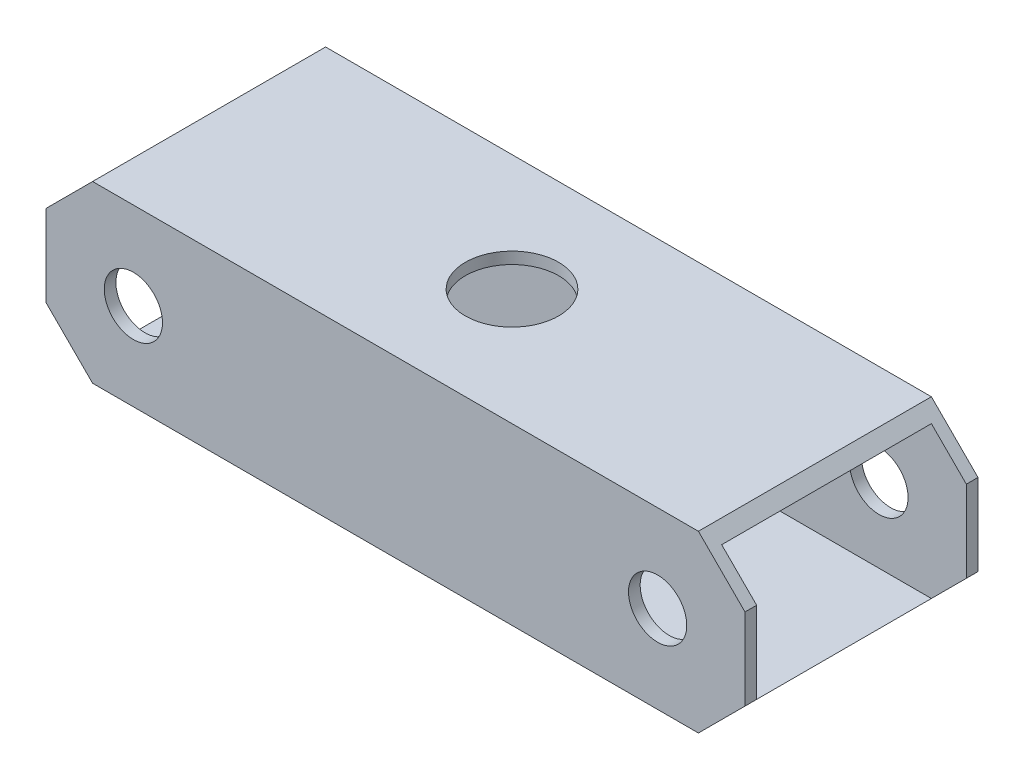
ISO-10303-21;
HEADER;
FILE_DESCRIPTION(('STEP AP214'),'2;1');
FILE_NAME('part.step','',(''),(''),'','','');
FILE_SCHEMA(('AUTOMOTIVE_DESIGN { 1 0 10303 214 1 1 1 1 }'));
ENDSEC;
DATA;
#1=APPLICATION_CONTEXT('core data for automotive mechanical design processes');
#2=APPLICATION_PROTOCOL_DEFINITION('international standard','automotive_design',2000,#1);
#3=PRODUCT_CONTEXT('',#1,'mechanical');
#4=PRODUCT('Part','Part','',(#3));
#5=PRODUCT_RELATED_PRODUCT_CATEGORY('part','',(#4));
#6=PRODUCT_DEFINITION_FORMATION('','',#4);
#7=PRODUCT_DEFINITION_CONTEXT('part definition',#1,'design');
#8=PRODUCT_DEFINITION('design','',#6,#7);
#9=PRODUCT_DEFINITION_SHAPE('','',#8);
#10=(LENGTH_UNIT() NAMED_UNIT(*) SI_UNIT(.MILLI.,.METRE.));
#11=(NAMED_UNIT(*) PLANE_ANGLE_UNIT() SI_UNIT($,.RADIAN.));
#12=(NAMED_UNIT(*) SI_UNIT($,.STERADIAN.) SOLID_ANGLE_UNIT());
#13=UNCERTAINTY_MEASURE_WITH_UNIT(LENGTH_MEASURE(1.E-05),#10,'distance_accuracy_value','');
#14=(GEOMETRIC_REPRESENTATION_CONTEXT(3) GLOBAL_UNCERTAINTY_ASSIGNED_CONTEXT((#13)) GLOBAL_UNIT_ASSIGNED_CONTEXT((#10,
#11,#12)) REPRESENTATION_CONTEXT('',''));
#15=CARTESIAN_POINT('',(0.,0.,0.));
#16=DIRECTION('',(0.,0.,1.));
#17=DIRECTION('',(1.,0.,0.));
#18=AXIS2_PLACEMENT_3D('',#15,#16,#17);
#19=CARTESIAN_POINT('',(120.,30.,0.));
#20=DIRECTION('',(-1.,0.,0.));
#21=DIRECTION('',(0.,0.,1.));
#22=AXIS2_PLACEMENT_3D('',#19,#20,#21);
#23=PLANE('',#22);
#24=DIRECTION('',(0.,-1.,0.));
#25=VECTOR('',#24,1.);
#26=CARTESIAN_POINT('',(120.,30.,0.));
#27=LINE('',#26,#25);
#28=CARTESIAN_POINT('',(120.,21.9999999999999,0.));
#29=VERTEX_POINT('',#28);
#30=CARTESIAN_POINT('',(120.,8.00000000000014,0.));
#31=VERTEX_POINT('',#30);
#32=EDGE_CURVE('E292',#29,#31,#27,.T.);
#33=ORIENTED_EDGE('',*,*,#32,.T.);
#34=DIRECTION('',(0.,0.,-1.));
#35=VECTOR('',#34,1.);
#36=CARTESIAN_POINT('',(120.,8.00000000000014,-40.));
#37=LINE('',#36,#35);
#38=CARTESIAN_POINT('',(120.,8.00000000000014,-2.));
#39=VERTEX_POINT('',#38);
#40=EDGE_CURVE('E14',#31,#39,#37,.T.);
#41=ORIENTED_EDGE('',*,*,#40,.T.);
#42=DIRECTION('',(0.,1.,0.));
#43=VECTOR('',#42,1.);
#44=CARTESIAN_POINT('',(120.,2.00000000000001,-2.));
#45=LINE('',#44,#43);
#46=CARTESIAN_POINT('',(120.,21.9999999999999,-2.));
#47=VERTEX_POINT('',#46);
#48=EDGE_CURVE('E349',#39,#47,#45,.T.);
#49=ORIENTED_EDGE('',*,*,#48,.T.);
#50=DIRECTION('',(0.,0.,1.));
#51=VECTOR('',#50,1.);
#52=CARTESIAN_POINT('',(120.,21.9999999999999,0.));
#53=LINE('',#52,#51);
#54=EDGE_CURVE('E515',#47,#29,#53,.T.);
#55=ORIENTED_EDGE('',*,*,#54,.T.);
#56=EDGE_LOOP('',(#33,#41,#49,#55));
#57=FACE_BOUND('',#56,.T.);
#58=ADVANCED_FACE('F156',(#57),#23,.F.);
#59=CARTESIAN_POINT('',(0.,30.,0.));
#60=DIRECTION('',(1.,0.,0.));
#61=DIRECTION('',(0.,0.,-1.));
#62=AXIS2_PLACEMENT_3D('',#59,#60,#61);
#63=PLANE('',#62);
#64=DIRECTION('',(0.,-1.,0.));
#65=VECTOR('',#64,1.);
#66=CARTESIAN_POINT('',(0.,30.,-40.));
#67=LINE('',#66,#65);
#68=CARTESIAN_POINT('',(0.,21.9999999999999,-40.));
#69=VERTEX_POINT('',#68);
#70=CARTESIAN_POINT('',(0.,8.00000000000014,-40.));
#71=VERTEX_POINT('',#70);
#72=EDGE_CURVE('E369',#69,#71,#67,.T.);
#73=ORIENTED_EDGE('',*,*,#72,.T.);
#74=DIRECTION('',(0.,0.,1.));
#75=VECTOR('',#74,1.);
#76=CARTESIAN_POINT('',(0.,8.00000000000014,0.));
#77=LINE('',#76,#75);
#78=CARTESIAN_POINT('',(0.,8.00000000000014,-38.));
#79=VERTEX_POINT('',#78);
#80=EDGE_CURVE('E299',#71,#79,#77,.T.);
#81=ORIENTED_EDGE('',*,*,#80,.T.);
#82=DIRECTION('',(0.,-1.,0.));
#83=VECTOR('',#82,1.);
#84=CARTESIAN_POINT('',(0.,28.,-38.));
#85=LINE('',#84,#83);
#86=CARTESIAN_POINT('',(0.,21.9999999999999,-38.));
#87=VERTEX_POINT('',#86);
#88=EDGE_CURVE('E350',#87,#79,#85,.T.);
#89=ORIENTED_EDGE('',*,*,#88,.F.);
#90=DIRECTION('',(0.,0.,-1.));
#91=VECTOR('',#90,1.);
#92=CARTESIAN_POINT('',(0.,21.9999999999999,0.));
#93=LINE('',#92,#91);
#94=EDGE_CURVE('E291',#87,#69,#93,.T.);
#95=ORIENTED_EDGE('',*,*,#94,.T.);
#96=EDGE_LOOP('',(#73,#81,#89,#95));
#97=FACE_BOUND('',#96,.T.);
#98=ADVANCED_FACE('F414',(#97),#63,.F.);
#99=DIRECTION('',(0.,1.,0.));
#100=VECTOR('',#99,1.);
#101=CARTESIAN_POINT('',(0.,2.00000000000001,-2.));
#102=LINE('',#101,#100);
#103=CARTESIAN_POINT('',(0.,8.00000000000014,-2.));
#104=VERTEX_POINT('',#103);
#105=CARTESIAN_POINT('',(0.,21.9999999999999,-2.));
#106=VERTEX_POINT('',#105);
#107=EDGE_CURVE('E346',#104,#106,#102,.T.);
#108=ORIENTED_EDGE('',*,*,#107,.F.);
#109=DIRECTION('',(0.,0.,1.));
#110=VECTOR('',#109,1.);
#111=CARTESIAN_POINT('',(0.,8.00000000000014,0.));
#112=LINE('',#111,#110);
#113=CARTESIAN_POINT('',(0.,8.00000000000014,0.));
#114=VERTEX_POINT('',#113);
#115=EDGE_CURVE('E290',#104,#114,#112,.T.);
#116=ORIENTED_EDGE('',*,*,#115,.T.);
#117=DIRECTION('',(0.,-1.,0.));
#118=VECTOR('',#117,1.);
#119=CARTESIAN_POINT('',(0.,30.,0.));
#120=LINE('',#119,#118);
#121=CARTESIAN_POINT('',(0.,21.9999999999999,0.));
#122=VERTEX_POINT('',#121);
#123=EDGE_CURVE('E273',#122,#114,#120,.T.);
#124=ORIENTED_EDGE('',*,*,#123,.F.);
#125=DIRECTION('',(0.,0.,-1.));
#126=VECTOR('',#125,1.);
#127=CARTESIAN_POINT('',(0.,21.9999999999999,0.));
#128=LINE('',#127,#126);
#129=EDGE_CURVE('E287',#122,#106,#128,.T.);
#130=ORIENTED_EDGE('',*,*,#129,.T.);
#131=EDGE_LOOP('',(#108,#116,#124,#130));
#132=FACE_BOUND('',#131,.T.);
#133=ADVANCED_FACE('F286',(#132),#63,.F.);
#134=DIRECTION('',(0.,-1.,0.));
#135=VECTOR('',#134,1.);
#136=CARTESIAN_POINT('',(120.,28.,-38.));
#137=LINE('',#136,#135);
#138=CARTESIAN_POINT('',(120.,21.9999999999999,-38.));
#139=VERTEX_POINT('',#138);
#140=CARTESIAN_POINT('',(120.,8.00000000000014,-38.));
#141=VERTEX_POINT('',#140);
#142=EDGE_CURVE('E307',#139,#141,#137,.T.);
#143=ORIENTED_EDGE('',*,*,#142,.T.);
#144=DIRECTION('',(0.,0.,-1.));
#145=VECTOR('',#144,1.);
#146=CARTESIAN_POINT('',(120.,8.00000000000014,-40.));
#147=LINE('',#146,#145);
#148=CARTESIAN_POINT('',(120.,8.00000000000014,-40.));
#149=VERTEX_POINT('',#148);
#150=EDGE_CURVE('E165',#141,#149,#147,.T.);
#151=ORIENTED_EDGE('',*,*,#150,.T.);
#152=DIRECTION('',(0.,-1.,0.));
#153=VECTOR('',#152,1.);
#154=CARTESIAN_POINT('',(120.,30.,-40.));
#155=LINE('',#154,#153);
#156=CARTESIAN_POINT('',(120.,21.9999999999999,-40.));
#157=VERTEX_POINT('',#156);
#158=EDGE_CURVE('E367',#157,#149,#155,.T.);
#159=ORIENTED_EDGE('',*,*,#158,.F.);
#160=DIRECTION('',(0.,0.,1.));
#161=VECTOR('',#160,1.);
#162=CARTESIAN_POINT('',(120.,21.9999999999999,0.));
#163=LINE('',#162,#161);
#164=EDGE_CURVE('E517',#157,#139,#163,.T.);
#165=ORIENTED_EDGE('',*,*,#164,.T.);
#166=EDGE_LOOP('',(#143,#151,#159,#165));
#167=FACE_BOUND('',#166,.T.);
#168=ADVANCED_FACE('F401',(#167),#23,.F.);
#169=CARTESIAN_POINT('',(15.,15.,0.));
#170=DIRECTION('',(0.,0.,-1.));
#171=DIRECTION('',(-1.,0.,0.));
#172=AXIS2_PLACEMENT_3D('',#169,#170,#171);
#173=CYLINDRICAL_SURFACE('',#172,5.);
#174=CARTESIAN_POINT('',(15.,15.,-40.));
#175=DIRECTION('',(0.,0.,-1.));
#176=DIRECTION('',(1.,0.,0.));
#177=AXIS2_PLACEMENT_3D('',#174,#175,#176);
#178=CIRCLE('',#177,5.);
#179=CARTESIAN_POINT('',(20.,15.,-40.));
#180=VERTEX_POINT('',#179);
#181=EDGE_CURVE('E383',#180,#180,#178,.T.);
#182=ORIENTED_EDGE('',*,*,#181,.T.);
#183=EDGE_LOOP('',(#182));
#184=FACE_BOUND('',#183,.T.);
#185=CARTESIAN_POINT('',(15.,15.,-38.));
#186=DIRECTION('',(0.,0.,1.));
#187=DIRECTION('',(0.,-1.,0.));
#188=AXIS2_PLACEMENT_3D('',#185,#186,#187);
#189=CIRCLE('',#188,5.);
#190=CARTESIAN_POINT('',(15.,9.99999999999999,-38.));
#191=VERTEX_POINT('',#190);
#192=EDGE_CURVE('E362',#191,#191,#189,.F.);
#193=ORIENTED_EDGE('',*,*,#192,.F.);
#194=EDGE_LOOP('',(#193));
#195=FACE_BOUND('',#194,.T.);
#196=ADVANCED_FACE('F398',(#184,#195),#173,.F.);
#197=CARTESIAN_POINT('',(15.,15.,0.));
#198=DIRECTION('',(0.,0.,-1.));
#199=DIRECTION('',(1.,0.,0.));
#200=AXIS2_PLACEMENT_3D('',#197,#198,#199);
#201=CIRCLE('',#200,5.);
#202=CARTESIAN_POINT('',(20.,15.,0.));
#203=VERTEX_POINT('',#202);
#204=EDGE_CURVE('E386',#203,#203,#201,.T.);
#205=ORIENTED_EDGE('',*,*,#204,.F.);
#206=EDGE_LOOP('',(#205));
#207=FACE_BOUND('',#206,.T.);
#208=CARTESIAN_POINT('',(15.,15.,-2.));
#209=DIRECTION('',(0.,0.,-1.));
#210=DIRECTION('',(0.,1.,0.));
#211=AXIS2_PLACEMENT_3D('',#208,#209,#210);
#212=CIRCLE('',#211,5.);
#213=CARTESIAN_POINT('',(15.,20.,-2.));
#214=VERTEX_POINT('',#213);
#215=EDGE_CURVE('E320',#214,#214,#212,.F.);
#216=ORIENTED_EDGE('',*,*,#215,.F.);
#217=EDGE_LOOP('',(#216));
#218=FACE_BOUND('',#217,.T.);
#219=ADVANCED_FACE('F400',(#207,#218),#173,.F.);
#220=CARTESIAN_POINT('',(105.,15.,0.));
#221=DIRECTION('',(0.,0.,-1.));
#222=DIRECTION('',(-1.,0.,0.));
#223=AXIS2_PLACEMENT_3D('',#220,#221,#222);
#224=CYLINDRICAL_SURFACE('',#223,5.);
#225=CARTESIAN_POINT('',(105.,15.,-40.));
#226=DIRECTION('',(0.,0.,-1.));
#227=DIRECTION('',(-1.,0.,0.));
#228=AXIS2_PLACEMENT_3D('',#225,#226,#227);
#229=CIRCLE('',#228,5.);
#230=CARTESIAN_POINT('',(100.,15.,-40.));
#231=VERTEX_POINT('',#230);
#232=EDGE_CURVE('E389',#231,#231,#229,.T.);
#233=ORIENTED_EDGE('',*,*,#232,.T.);
#234=EDGE_LOOP('',(#233));
#235=FACE_BOUND('',#234,.T.);
#236=CARTESIAN_POINT('',(105.,15.,-38.));
#237=DIRECTION('',(0.,0.,1.));
#238=DIRECTION('',(0.,-1.,0.));
#239=AXIS2_PLACEMENT_3D('',#236,#237,#238);
#240=CIRCLE('',#239,5.);
#241=CARTESIAN_POINT('',(105.,9.99999999999999,-38.));
#242=VERTEX_POINT('',#241);
#243=EDGE_CURVE('E359',#242,#242,#240,.F.);
#244=ORIENTED_EDGE('',*,*,#243,.F.);
#245=EDGE_LOOP('',(#244));
#246=FACE_BOUND('',#245,.T.);
#247=ADVANCED_FACE('F408',(#235,#246),#224,.F.);
#248=CARTESIAN_POINT('',(105.,15.,0.));
#249=DIRECTION('',(0.,0.,-1.));
#250=DIRECTION('',(-1.,0.,0.));
#251=AXIS2_PLACEMENT_3D('',#248,#249,#250);
#252=CIRCLE('',#251,5.);
#253=CARTESIAN_POINT('',(100.,15.,0.));
#254=VERTEX_POINT('',#253);
#255=EDGE_CURVE('E379',#254,#254,#252,.T.);
#256=ORIENTED_EDGE('',*,*,#255,.F.);
#257=EDGE_LOOP('',(#256));
#258=FACE_BOUND('',#257,.T.);
#259=CARTESIAN_POINT('',(105.,15.,-2.));
#260=DIRECTION('',(0.,0.,-1.));
#261=DIRECTION('',(0.,1.,0.));
#262=AXIS2_PLACEMENT_3D('',#259,#260,#261);
#263=CIRCLE('',#262,5.);
#264=CARTESIAN_POINT('',(105.,20.,-2.));
#265=VERTEX_POINT('',#264);
#266=EDGE_CURVE('E348',#265,#265,#263,.F.);
#267=ORIENTED_EDGE('',*,*,#266,.F.);
#268=EDGE_LOOP('',(#267));
#269=FACE_BOUND('',#268,.T.);
#270=ADVANCED_FACE('F425',(#258,#269),#224,.F.);
#271=CARTESIAN_POINT('',(0.,30.,0.));
#272=DIRECTION('',(0.,0.,-1.));
#273=DIRECTION('',(-1.,0.,0.));
#274=AXIS2_PLACEMENT_3D('',#271,#272,#273);
#275=PLANE('',#274);
#276=ORIENTED_EDGE('',*,*,#255,.T.);
#277=EDGE_LOOP('',(#276));
#278=FACE_BOUND('',#277,.T.);
#279=ORIENTED_EDGE('',*,*,#204,.T.);
#280=EDGE_LOOP('',(#279));
#281=FACE_BOUND('',#280,.T.);
#282=ORIENTED_EDGE('',*,*,#123,.T.);
#283=DIRECTION('',(0.707106781186544,-0.707106781186551,0.));
#284=VECTOR('',#283,1.);
#285=CARTESIAN_POINT('',(0.,8.00000000000014,0.));
#286=LINE('',#285,#284);
#287=CARTESIAN_POINT('',(8.00000000000006,0.,0.));
#288=VERTEX_POINT('',#287);
#289=EDGE_CURVE('E281',#114,#288,#286,.T.);
#290=ORIENTED_EDGE('',*,*,#289,.T.);
#291=DIRECTION('',(1.,0.,0.));
#292=VECTOR('',#291,1.);
#293=CARTESIAN_POINT('',(0.,0.,0.));
#294=LINE('',#293,#292);
#295=CARTESIAN_POINT('',(112.,0.,0.));
#296=VERTEX_POINT('',#295);
#297=EDGE_CURVE('E376',#288,#296,#294,.T.);
#298=ORIENTED_EDGE('',*,*,#297,.T.);
#299=DIRECTION('',(0.707106781186544,0.707106781186551,0.));
#300=VECTOR('',#299,1.);
#301=CARTESIAN_POINT('',(120.,8.00000000000014,0.));
#302=LINE('',#301,#300);
#303=EDGE_CURVE('E282',#296,#31,#302,.T.);
#304=ORIENTED_EDGE('',*,*,#303,.T.);
#305=ORIENTED_EDGE('',*,*,#32,.F.);
#306=DIRECTION('',(0.707106781186552,-0.707106781186544,0.));
#307=VECTOR('',#306,1.);
#308=CARTESIAN_POINT('',(112.,30.,0.));
#309=LINE('',#308,#307);
#310=CARTESIAN_POINT('',(112.,30.,0.));
#311=VERTEX_POINT('',#310);
#312=EDGE_CURVE('E489',#29,#311,#309,.F.);
#313=ORIENTED_EDGE('',*,*,#312,.T.);
#314=DIRECTION('',(1.,0.,0.));
#315=VECTOR('',#314,1.);
#316=CARTESIAN_POINT('',(0.,30.,0.));
#317=LINE('',#316,#315);
#318=CARTESIAN_POINT('',(8.00000000000014,30.,0.));
#319=VERTEX_POINT('',#318);
#320=EDGE_CURVE('E276',#319,#311,#317,.T.);
#321=ORIENTED_EDGE('',*,*,#320,.F.);
#322=DIRECTION('',(0.707106781186551,0.707106781186544,0.));
#323=VECTOR('',#322,1.);
#324=CARTESIAN_POINT('',(8.00000000000014,30.,0.));
#325=LINE('',#324,#323);
#326=EDGE_CURVE('E270',#319,#122,#325,.F.);
#327=ORIENTED_EDGE('',*,*,#326,.T.);
#328=EDGE_LOOP('',(#282,#290,#298,#304,#305,#313,#321,#327));
#329=FACE_BOUND('',#328,.T.);
#330=ADVANCED_FACE('F272',(#278,#281,#329),#275,.F.);
#331=CARTESIAN_POINT('',(0.,30.,-40.));
#332=DIRECTION('',(0.,0.,1.));
#333=DIRECTION('',(1.,0.,0.));
#334=AXIS2_PLACEMENT_3D('',#331,#332,#333);
#335=PLANE('',#334);
#336=ORIENTED_EDGE('',*,*,#232,.F.);
#337=EDGE_LOOP('',(#336));
#338=FACE_BOUND('',#337,.T.);
#339=ORIENTED_EDGE('',*,*,#181,.F.);
#340=EDGE_LOOP('',(#339));
#341=FACE_BOUND('',#340,.T.);
#342=DIRECTION('',(-1.,0.,0.));
#343=VECTOR('',#342,1.);
#344=CARTESIAN_POINT('',(0.,0.,-40.));
#345=LINE('',#344,#343);
#346=CARTESIAN_POINT('',(112.,0.,-40.));
#347=VERTEX_POINT('',#346);
#348=CARTESIAN_POINT('',(8.00000000000006,0.,-40.));
#349=VERTEX_POINT('',#348);
#350=EDGE_CURVE('E373',#347,#349,#345,.T.);
#351=ORIENTED_EDGE('',*,*,#350,.T.);
#352=DIRECTION('',(-0.707106781186544,0.707106781186551,0.));
#353=VECTOR('',#352,1.);
#354=CARTESIAN_POINT('',(0.,8.00000000000014,-40.));
#355=LINE('',#354,#353);
#356=EDGE_CURVE('E504',#349,#71,#355,.T.);
#357=ORIENTED_EDGE('',*,*,#356,.T.);
#358=ORIENTED_EDGE('',*,*,#72,.F.);
#359=DIRECTION('',(-0.707106781186551,-0.707106781186544,0.));
#360=VECTOR('',#359,1.);
#361=CARTESIAN_POINT('',(8.00000000000014,30.,-40.));
#362=LINE('',#361,#360);
#363=CARTESIAN_POINT('',(8.00000000000014,30.,-40.));
#364=VERTEX_POINT('',#363);
#365=EDGE_CURVE('E502',#69,#364,#362,.F.);
#366=ORIENTED_EDGE('',*,*,#365,.T.);
#367=DIRECTION('',(-1.,0.,0.));
#368=VECTOR('',#367,1.);
#369=CARTESIAN_POINT('',(0.,30.,-40.));
#370=LINE('',#369,#368);
#371=CARTESIAN_POINT('',(112.,30.,-40.));
#372=VERTEX_POINT('',#371);
#373=EDGE_CURVE('E372',#372,#364,#370,.T.);
#374=ORIENTED_EDGE('',*,*,#373,.F.);
#375=DIRECTION('',(-0.707106781186552,0.707106781186544,0.));
#376=VECTOR('',#375,1.);
#377=CARTESIAN_POINT('',(112.,30.,-40.));
#378=LINE('',#377,#376);
#379=EDGE_CURVE('E178',#372,#157,#378,.F.);
#380=ORIENTED_EDGE('',*,*,#379,.T.);
#381=ORIENTED_EDGE('',*,*,#158,.T.);
#382=DIRECTION('',(-0.707106781186544,-0.707106781186551,0.));
#383=VECTOR('',#382,1.);
#384=CARTESIAN_POINT('',(120.,8.00000000000014,-40.));
#385=LINE('',#384,#383);
#386=EDGE_CURVE('E500',#149,#347,#385,.T.);
#387=ORIENTED_EDGE('',*,*,#386,.T.);
#388=EDGE_LOOP('',(#351,#357,#358,#366,#374,#380,#381,#387));
#389=FACE_BOUND('',#388,.T.);
#390=ADVANCED_FACE('F422',(#338,#341,#389),#335,.F.);
#391=CARTESIAN_POINT('',(0.,30.,0.));
#392=DIRECTION('',(0.,-1.,0.));
#393=DIRECTION('',(0.,0.,-1.));
#394=AXIS2_PLACEMENT_3D('',#391,#392,#393);
#395=PLANE('',#394);
#396=CARTESIAN_POINT('',(60.,30.,-20.));
#397=DIRECTION('',(0.,1.,0.));
#398=DIRECTION('',(0.,0.,1.));
#399=AXIS2_PLACEMENT_3D('',#396,#397,#398);
#400=CIRCLE('',#399,8.);
#401=CARTESIAN_POINT('',(60.,30.,-12.));
#402=VERTEX_POINT('',#401);
#403=EDGE_CURVE('E358',#402,#402,#400,.T.);
#404=ORIENTED_EDGE('',*,*,#403,.F.);
#405=EDGE_LOOP('',(#404));
#406=FACE_BOUND('',#405,.T.);
#407=ORIENTED_EDGE('',*,*,#373,.T.);
#408=DIRECTION('',(0.,0.,1.));
#409=VECTOR('',#408,1.);
#410=CARTESIAN_POINT('',(8.00000000000014,30.,0.));
#411=LINE('',#410,#409);
#412=EDGE_CURVE('E509',#364,#319,#411,.T.);
#413=ORIENTED_EDGE('',*,*,#412,.T.);
#414=ORIENTED_EDGE('',*,*,#320,.T.);
#415=DIRECTION('',(0.,0.,-1.));
#416=VECTOR('',#415,1.);
#417=CARTESIAN_POINT('',(112.,30.,0.));
#418=LINE('',#417,#416);
#419=EDGE_CURVE('E506',#311,#372,#418,.T.);
#420=ORIENTED_EDGE('',*,*,#419,.T.);
#421=EDGE_LOOP('',(#407,#413,#414,#420));
#422=FACE_BOUND('',#421,.T.);
#423=ADVANCED_FACE('F563',(#406,#422),#395,.F.);
#424=CARTESIAN_POINT('',(0.,0.,0.));
#425=DIRECTION('',(0.,-1.,0.));
#426=DIRECTION('',(0.,0.,-1.));
#427=AXIS2_PLACEMENT_3D('',#424,#425,#426);
#428=PLANE('',#427);
#429=CARTESIAN_POINT('',(60.,0.,-20.));
#430=DIRECTION('',(0.,-1.,0.));
#431=DIRECTION('',(0.,0.,-1.));
#432=AXIS2_PLACEMENT_3D('',#429,#430,#431);
#433=CIRCLE('',#432,8.);
#434=CARTESIAN_POINT('',(60.,0.,-28.));
#435=VERTEX_POINT('',#434);
#436=EDGE_CURVE('E325',#435,#435,#433,.T.);
#437=ORIENTED_EDGE('',*,*,#436,.F.);
#438=EDGE_LOOP('',(#437));
#439=FACE_BOUND('',#438,.T.);
#440=ORIENTED_EDGE('',*,*,#297,.F.);
#441=DIRECTION('',(0.,0.,-1.));
#442=VECTOR('',#441,1.);
#443=CARTESIAN_POINT('',(8.00000000000006,0.,-40.));
#444=LINE('',#443,#442);
#445=EDGE_CURVE('E497',#288,#349,#444,.T.);
#446=ORIENTED_EDGE('',*,*,#445,.T.);
#447=ORIENTED_EDGE('',*,*,#350,.F.);
#448=DIRECTION('',(0.,0.,1.));
#449=VECTOR('',#448,1.);
#450=CARTESIAN_POINT('',(112.,0.,0.));
#451=LINE('',#450,#449);
#452=EDGE_CURVE('E487',#347,#296,#451,.T.);
#453=ORIENTED_EDGE('',*,*,#452,.T.);
#454=EDGE_LOOP('',(#440,#446,#447,#453));
#455=FACE_BOUND('',#454,.T.);
#456=ADVANCED_FACE('F553',(#439,#455),#428,.T.);
#457=CARTESIAN_POINT('',(0.,28.,-38.));
#458=DIRECTION('',(0.,0.,1.));
#459=DIRECTION('',(0.,-1.,0.));
#460=AXIS2_PLACEMENT_3D('',#457,#458,#459);
#461=PLANE('',#460);
#462=ORIENTED_EDGE('',*,*,#88,.T.);
#463=DIRECTION('',(0.707106781186544,-0.707106781186551,0.));
#464=VECTOR('',#463,1.);
#465=CARTESIAN_POINT('',(-9.99999999999993,18.0000000000002,-38.));
#466=LINE('',#465,#464);
#467=CARTESIAN_POINT('',(6.00000000000007,2.00000000000001,-38.));
#468=VERTEX_POINT('',#467);
#469=EDGE_CURVE('E331',#79,#468,#466,.T.);
#470=ORIENTED_EDGE('',*,*,#469,.T.);
#471=DIRECTION('',(1.,0.,0.));
#472=VECTOR('',#471,1.);
#473=CARTESIAN_POINT('',(0.,2.00000000000001,-38.));
#474=LINE('',#473,#472);
#475=CARTESIAN_POINT('',(114.,2.00000000000001,-38.));
#476=VERTEX_POINT('',#475);
#477=EDGE_CURVE('E322',#468,#476,#474,.T.);
#478=ORIENTED_EDGE('',*,*,#477,.T.);
#479=DIRECTION('',(0.707106781186544,0.707106781186551,0.));
#480=VECTOR('',#479,1.);
#481=CARTESIAN_POINT('',(70.0000000000005,-41.9999999999998,-38.));
#482=LINE('',#481,#480);
#483=EDGE_CURVE('E327',#476,#141,#482,.T.);
#484=ORIENTED_EDGE('',*,*,#483,.T.);
#485=ORIENTED_EDGE('',*,*,#142,.F.);
#486=DIRECTION('',(0.707106781186552,-0.707106781186544,0.));
#487=VECTOR('',#486,1.);
#488=CARTESIAN_POINT('',(56.9999999999993,84.9999999999999,-38.));
#489=LINE('',#488,#487);
#490=CARTESIAN_POINT('',(114.,28.,-38.));
#491=VERTEX_POINT('',#490);
#492=EDGE_CURVE('E306',#139,#491,#489,.F.);
#493=ORIENTED_EDGE('',*,*,#492,.T.);
#494=DIRECTION('',(1.,0.,0.));
#495=VECTOR('',#494,1.);
#496=CARTESIAN_POINT('',(0.,28.,-38.));
#497=LINE('',#496,#495);
#498=CARTESIAN_POINT('',(6.00000000000012,28.,-38.));
#499=VERTEX_POINT('',#498);
#500=EDGE_CURVE('E310',#499,#491,#497,.T.);
#501=ORIENTED_EDGE('',*,*,#500,.F.);
#502=DIRECTION('',(0.707106781186551,0.707106781186544,0.));
#503=VECTOR('',#502,1.);
#504=CARTESIAN_POINT('',(3.00000000000003,24.9999999999999,-38.));
#505=LINE('',#504,#503);
#506=EDGE_CURVE('E329',#499,#87,#505,.F.);
#507=ORIENTED_EDGE('',*,*,#506,.T.);
#508=EDGE_LOOP('',(#462,#470,#478,#484,#485,#493,#501,#507));
#509=FACE_BOUND('',#508,.T.);
#510=ORIENTED_EDGE('',*,*,#243,.T.);
#511=EDGE_LOOP('',(#510));
#512=FACE_BOUND('',#511,.T.);
#513=ORIENTED_EDGE('',*,*,#192,.T.);
#514=EDGE_LOOP('',(#513));
#515=FACE_BOUND('',#514,.T.);
#516=ADVANCED_FACE('F396',(#509,#512,#515),#461,.T.);
#517=CARTESIAN_POINT('',(0.,2.00000000000001,-2.));
#518=DIRECTION('',(0.,0.,-1.));
#519=DIRECTION('',(0.,1.,0.));
#520=AXIS2_PLACEMENT_3D('',#517,#518,#519);
#521=PLANE('',#520);
#522=DIRECTION('',(1.,0.,0.));
#523=VECTOR('',#522,1.);
#524=CARTESIAN_POINT('',(0.,2.00000000000001,-2.));
#525=LINE('',#524,#523);
#526=CARTESIAN_POINT('',(6.00000000000007,2.00000000000001,-2.));
#527=VERTEX_POINT('',#526);
#528=CARTESIAN_POINT('',(114.,2.00000000000001,-2.));
#529=VERTEX_POINT('',#528);
#530=EDGE_CURVE('E311',#527,#529,#525,.T.);
#531=ORIENTED_EDGE('',*,*,#530,.F.);
#532=DIRECTION('',(-0.707106781186544,0.707106781186551,0.));
#533=VECTOR('',#532,1.);
#534=CARTESIAN_POINT('',(3.00000000000007,5.00000000000004,-2.));
#535=LINE('',#534,#533);
#536=EDGE_CURVE('E491',#527,#104,#535,.T.);
#537=ORIENTED_EDGE('',*,*,#536,.T.);
#538=ORIENTED_EDGE('',*,*,#107,.T.);
#539=DIRECTION('',(-0.707106781186551,-0.707106781186544,0.));
#540=VECTOR('',#539,1.);
#541=CARTESIAN_POINT('',(-9.99999999999997,12.0000000000001,-2.));
#542=LINE('',#541,#540);
#543=CARTESIAN_POINT('',(6.00000000000012,28.,-2.));
#544=VERTEX_POINT('',#543);
#545=EDGE_CURVE('E297',#106,#544,#542,.F.);
#546=ORIENTED_EDGE('',*,*,#545,.T.);
#547=DIRECTION('',(1.,0.,0.));
#548=VECTOR('',#547,1.);
#549=CARTESIAN_POINT('',(0.,28.,-2.));
#550=LINE('',#549,#548);
#551=CARTESIAN_POINT('',(114.,28.,-2.));
#552=VERTEX_POINT('',#551);
#553=EDGE_CURVE('E353',#544,#552,#550,.T.);
#554=ORIENTED_EDGE('',*,*,#553,.T.);
#555=DIRECTION('',(-0.707106781186552,0.707106781186544,0.));
#556=VECTOR('',#555,1.);
#557=CARTESIAN_POINT('',(69.9999999999993,72.0000000000001,-2.));
#558=LINE('',#557,#556);
#559=EDGE_CURVE('E529',#552,#47,#558,.F.);
#560=ORIENTED_EDGE('',*,*,#559,.T.);
#561=ORIENTED_EDGE('',*,*,#48,.F.);
#562=DIRECTION('',(-0.707106781186544,-0.707106781186551,0.));
#563=VECTOR('',#562,1.);
#564=CARTESIAN_POINT('',(57.0000000000005,-55.,-2.00000000000001));
#565=LINE('',#564,#563);
#566=EDGE_CURVE('E544',#39,#529,#565,.T.);
#567=ORIENTED_EDGE('',*,*,#566,.T.);
#568=EDGE_LOOP('',(#531,#537,#538,#546,#554,#560,#561,#567));
#569=FACE_BOUND('',#568,.T.);
#570=ORIENTED_EDGE('',*,*,#266,.T.);
#571=EDGE_LOOP('',(#570));
#572=FACE_BOUND('',#571,.T.);
#573=ORIENTED_EDGE('',*,*,#215,.T.);
#574=EDGE_LOOP('',(#573));
#575=FACE_BOUND('',#574,.T.);
#576=ADVANCED_FACE('F536',(#569,#572,#575),#521,.T.);
#577=CARTESIAN_POINT('',(0.,2.00000000000001,-38.));
#578=DIRECTION('',(0.,1.,0.));
#579=DIRECTION('',(0.,0.,1.));
#580=AXIS2_PLACEMENT_3D('',#577,#578,#579);
#581=PLANE('',#580);
#582=CARTESIAN_POINT('',(60.,2.,-20.));
#583=DIRECTION('',(0.,1.,0.));
#584=DIRECTION('',(0.,0.,1.));
#585=AXIS2_PLACEMENT_3D('',#582,#583,#584);
#586=CIRCLE('',#585,8.);
#587=CARTESIAN_POINT('',(60.,2.,-12.));
#588=VERTEX_POINT('',#587);
#589=EDGE_CURVE('E357',#588,#588,#586,.T.);
#590=ORIENTED_EDGE('',*,*,#589,.F.);
#591=EDGE_LOOP('',(#590));
#592=FACE_BOUND('',#591,.T.);
#593=ORIENTED_EDGE('',*,*,#477,.F.);
#594=DIRECTION('',(0.,0.,1.));
#595=VECTOR('',#594,1.);
#596=CARTESIAN_POINT('',(6.00000000000007,2.00000000000001,-38.));
#597=LINE('',#596,#595);
#598=EDGE_CURVE('E545',#468,#527,#597,.T.);
#599=ORIENTED_EDGE('',*,*,#598,.T.);
#600=ORIENTED_EDGE('',*,*,#530,.T.);
#601=DIRECTION('',(0.,0.,-1.));
#602=VECTOR('',#601,1.);
#603=CARTESIAN_POINT('',(114.,2.00000000000001,-38.));
#604=LINE('',#603,#602);
#605=EDGE_CURVE('E333',#529,#476,#604,.T.);
#606=ORIENTED_EDGE('',*,*,#605,.T.);
#607=EDGE_LOOP('',(#593,#599,#600,#606));
#608=FACE_BOUND('',#607,.T.);
#609=ADVANCED_FACE('F568',(#592,#608),#581,.T.);
#610=CARTESIAN_POINT('',(0.,28.,-2.));
#611=DIRECTION('',(0.,-1.,0.));
#612=DIRECTION('',(0.,0.,-1.));
#613=AXIS2_PLACEMENT_3D('',#610,#611,#612);
#614=PLANE('',#613);
#615=CARTESIAN_POINT('',(60.,28.,-20.));
#616=DIRECTION('',(0.,-1.,0.));
#617=DIRECTION('',(0.,0.,-1.));
#618=AXIS2_PLACEMENT_3D('',#615,#616,#617);
#619=CIRCLE('',#618,8.);
#620=CARTESIAN_POINT('',(60.,28.,-28.));
#621=VERTEX_POINT('',#620);
#622=EDGE_CURVE('E354',#621,#621,#619,.T.);
#623=ORIENTED_EDGE('',*,*,#622,.F.);
#624=EDGE_LOOP('',(#623));
#625=FACE_BOUND('',#624,.T.);
#626=ORIENTED_EDGE('',*,*,#553,.F.);
#627=DIRECTION('',(0.,0.,1.));
#628=VECTOR('',#627,1.);
#629=CARTESIAN_POINT('',(6.00000000000012,28.,-2.));
#630=LINE('',#629,#628);
#631=EDGE_CURVE('E513',#544,#499,#630,.F.);
#632=ORIENTED_EDGE('',*,*,#631,.T.);
#633=ORIENTED_EDGE('',*,*,#500,.T.);
#634=DIRECTION('',(0.,0.,-1.));
#635=VECTOR('',#634,1.);
#636=CARTESIAN_POINT('',(114.,28.,-1.99999999999999));
#637=LINE('',#636,#635);
#638=EDGE_CURVE('E511',#491,#552,#637,.F.);
#639=ORIENTED_EDGE('',*,*,#638,.T.);
#640=EDGE_LOOP('',(#626,#632,#633,#639));
#641=FACE_BOUND('',#640,.T.);
#642=ADVANCED_FACE('F533',(#625,#641),#614,.T.);
#643=CARTESIAN_POINT('',(60.,-90.,-20.));
#644=DIRECTION('',(0.,1.,0.));
#645=DIRECTION('',(0.,0.,1.));
#646=AXIS2_PLACEMENT_3D('',#643,#644,#645);
#647=CYLINDRICAL_SURFACE('',#646,8.);
#648=ORIENTED_EDGE('',*,*,#622,.T.);
#649=EDGE_LOOP('',(#648));
#650=FACE_BOUND('',#649,.T.);
#651=ORIENTED_EDGE('',*,*,#403,.T.);
#652=EDGE_LOOP('',(#651));
#653=FACE_BOUND('',#652,.T.);
#654=ADVANCED_FACE('F572',(#650,#653),#647,.F.);
#655=ORIENTED_EDGE('',*,*,#436,.T.);
#656=EDGE_LOOP('',(#655));
#657=FACE_BOUND('',#656,.T.);
#658=ORIENTED_EDGE('',*,*,#589,.T.);
#659=EDGE_LOOP('',(#658));
#660=FACE_BOUND('',#659,.T.);
#661=ADVANCED_FACE('F468',(#657,#660),#647,.F.);
#662=CARTESIAN_POINT('',(0.,8.00000000000014,0.));
#663=DIRECTION('',(-0.707106781186551,-0.707106781186544,0.));
#664=DIRECTION('',(0.,0.,-1.));
#665=AXIS2_PLACEMENT_3D('',#662,#663,#664);
#666=PLANE('',#665);
#667=ORIENTED_EDGE('',*,*,#356,.F.);
#668=ORIENTED_EDGE('',*,*,#445,.F.);
#669=ORIENTED_EDGE('',*,*,#289,.F.);
#670=ORIENTED_EDGE('',*,*,#115,.F.);
#671=ORIENTED_EDGE('',*,*,#536,.F.);
#672=ORIENTED_EDGE('',*,*,#598,.F.);
#673=ORIENTED_EDGE('',*,*,#469,.F.);
#674=ORIENTED_EDGE('',*,*,#80,.F.);
#675=EDGE_LOOP('',(#667,#668,#669,#670,#671,#672,#673,#674));
#676=FACE_BOUND('',#675,.T.);
#677=ADVANCED_FACE('F431',(#676),#666,.T.);
#678=CARTESIAN_POINT('',(8.00000000000014,30.,0.));
#679=DIRECTION('',(0.707106781186544,-0.707106781186551,0.));
#680=DIRECTION('',(0.,0.,1.));
#681=AXIS2_PLACEMENT_3D('',#678,#679,#680);
#682=PLANE('',#681);
#683=ORIENTED_EDGE('',*,*,#545,.F.);
#684=ORIENTED_EDGE('',*,*,#129,.F.);
#685=ORIENTED_EDGE('',*,*,#326,.F.);
#686=ORIENTED_EDGE('',*,*,#412,.F.);
#687=ORIENTED_EDGE('',*,*,#365,.F.);
#688=ORIENTED_EDGE('',*,*,#94,.F.);
#689=ORIENTED_EDGE('',*,*,#506,.F.);
#690=ORIENTED_EDGE('',*,*,#631,.F.);
#691=EDGE_LOOP('',(#683,#684,#685,#686,#687,#688,#689,#690));
#692=FACE_BOUND('',#691,.T.);
#693=ADVANCED_FACE('F295',(#692),#682,.F.);
#694=CARTESIAN_POINT('',(120.,8.00000000000014,0.));
#695=DIRECTION('',(0.707106781186551,-0.707106781186544,0.));
#696=DIRECTION('',(0.,0.,1.));
#697=AXIS2_PLACEMENT_3D('',#694,#695,#696);
#698=PLANE('',#697);
#699=ORIENTED_EDGE('',*,*,#303,.F.);
#700=ORIENTED_EDGE('',*,*,#452,.F.);
#701=ORIENTED_EDGE('',*,*,#386,.F.);
#702=ORIENTED_EDGE('',*,*,#150,.F.);
#703=ORIENTED_EDGE('',*,*,#483,.F.);
#704=ORIENTED_EDGE('',*,*,#605,.F.);
#705=ORIENTED_EDGE('',*,*,#566,.F.);
#706=ORIENTED_EDGE('',*,*,#40,.F.);
#707=EDGE_LOOP('',(#699,#700,#701,#702,#703,#704,#705,#706));
#708=FACE_BOUND('',#707,.T.);
#709=ADVANCED_FACE('F474',(#708),#698,.T.);
#710=CARTESIAN_POINT('',(112.,30.,0.));
#711=DIRECTION('',(-0.707106781186544,-0.707106781186552,0.));
#712=DIRECTION('',(0.,0.,-1.));
#713=AXIS2_PLACEMENT_3D('',#710,#711,#712);
#714=PLANE('',#713);
#715=ORIENTED_EDGE('',*,*,#492,.F.);
#716=ORIENTED_EDGE('',*,*,#164,.F.);
#717=ORIENTED_EDGE('',*,*,#379,.F.);
#718=ORIENTED_EDGE('',*,*,#419,.F.);
#719=ORIENTED_EDGE('',*,*,#312,.F.);
#720=ORIENTED_EDGE('',*,*,#54,.F.);
#721=ORIENTED_EDGE('',*,*,#559,.F.);
#722=ORIENTED_EDGE('',*,*,#638,.F.);
#723=EDGE_LOOP('',(#715,#716,#717,#718,#719,#720,#721,#722));
#724=FACE_BOUND('',#723,.T.);
#725=ADVANCED_FACE('F159',(#724),#714,.F.);
#726=CLOSED_SHELL('',(#58,#98,#133,#168,#196,#219,#247,#270,#330,#390,#423,#456,#516,#576,#609,
#642,#654,#661,#677,#693,#709,#725));
#727=MANIFOLD_SOLID_BREP('B2',#726);
#728=ADVANCED_BREP_SHAPE_REPRESENTATION('',(#18,#727),#14);
#729=SHAPE_DEFINITION_REPRESENTATION(#9,#728);
ENDSEC;
END-ISO-10303-21;
